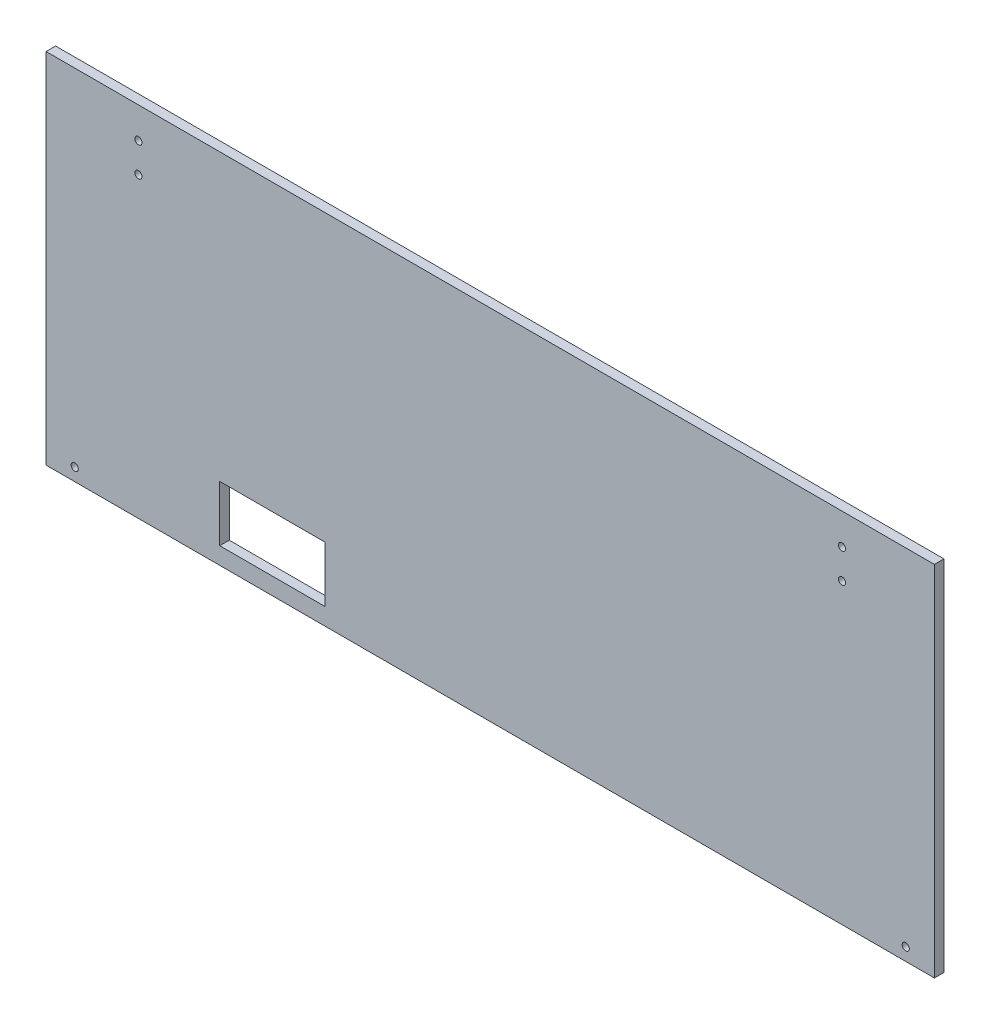
ISO-10303-21;
HEADER;
FILE_DESCRIPTION(('STEP AP214'),'2;1');
FILE_NAME('part.step','',(''),(''),'','','');
FILE_SCHEMA(('AUTOMOTIVE_DESIGN { 1 0 10303 214 1 1 1 1 }'));
ENDSEC;
DATA;
#1=APPLICATION_CONTEXT('core data for automotive mechanical design processes');
#2=APPLICATION_PROTOCOL_DEFINITION('international standard','automotive_design',2000,#1);
#3=PRODUCT_CONTEXT('',#1,'mechanical');
#4=PRODUCT('Part','Part','',(#3));
#5=PRODUCT_RELATED_PRODUCT_CATEGORY('part','',(#4));
#6=PRODUCT_DEFINITION_FORMATION('','',#4);
#7=PRODUCT_DEFINITION_CONTEXT('part definition',#1,'design');
#8=PRODUCT_DEFINITION('design','',#6,#7);
#9=PRODUCT_DEFINITION_SHAPE('','',#8);
#10=(LENGTH_UNIT() NAMED_UNIT(*) SI_UNIT(.MILLI.,.METRE.));
#11=(NAMED_UNIT(*) PLANE_ANGLE_UNIT() SI_UNIT($,.RADIAN.));
#12=(NAMED_UNIT(*) SI_UNIT($,.STERADIAN.) SOLID_ANGLE_UNIT());
#13=UNCERTAINTY_MEASURE_WITH_UNIT(LENGTH_MEASURE(1.E-05),#10,'distance_accuracy_value','');
#14=(GEOMETRIC_REPRESENTATION_CONTEXT(3) GLOBAL_UNCERTAINTY_ASSIGNED_CONTEXT((#13)) GLOBAL_UNIT_ASSIGNED_CONTEXT((#10,
#11,#12)) REPRESENTATION_CONTEXT('',''));
#15=CARTESIAN_POINT('',(0.,0.,0.));
#16=DIRECTION('',(0.,0.,1.));
#17=DIRECTION('',(1.,0.,0.));
#18=AXIS2_PLACEMENT_3D('',#15,#16,#17);
#19=CARTESIAN_POINT('',(279.,-112.5,6.));
#20=DIRECTION('',(-1.,0.,0.));
#21=DIRECTION('',(0.,0.,1.));
#22=AXIS2_PLACEMENT_3D('',#19,#20,#21);
#23=PLANE('',#22);
#24=DIRECTION('',(0.,1.,0.));
#25=VECTOR('',#24,1.);
#26=CARTESIAN_POINT('',(279.,-112.5,0.));
#27=LINE('',#26,#25);
#28=CARTESIAN_POINT('',(279.,-112.5,0.));
#29=VERTEX_POINT('',#28);
#30=CARTESIAN_POINT('',(279.,112.5,0.));
#31=VERTEX_POINT('',#30);
#32=EDGE_CURVE('E170',#29,#31,#27,.T.);
#33=ORIENTED_EDGE('',*,*,#32,.T.);
#34=DIRECTION('',(0.,0.,-1.));
#35=VECTOR('',#34,1.);
#36=CARTESIAN_POINT('',(279.,112.5,6.));
#37=LINE('',#36,#35);
#38=CARTESIAN_POINT('',(279.,112.5,6.));
#39=VERTEX_POINT('',#38);
#40=EDGE_CURVE('E11',#39,#31,#37,.T.);
#41=ORIENTED_EDGE('',*,*,#40,.F.);
#42=DIRECTION('',(0.,1.,0.));
#43=VECTOR('',#42,1.);
#44=CARTESIAN_POINT('',(279.,-112.5,6.));
#45=LINE('',#44,#43);
#46=CARTESIAN_POINT('',(279.,-112.5,6.));
#47=VERTEX_POINT('',#46);
#48=EDGE_CURVE('E171',#47,#39,#45,.T.);
#49=ORIENTED_EDGE('',*,*,#48,.F.);
#50=DIRECTION('',(0.,0.,-1.));
#51=VECTOR('',#50,1.);
#52=CARTESIAN_POINT('',(279.,-112.5,6.));
#53=LINE('',#52,#51);
#54=EDGE_CURVE('E181',#47,#29,#53,.T.);
#55=ORIENTED_EDGE('',*,*,#54,.T.);
#56=EDGE_LOOP('',(#33,#41,#49,#55));
#57=FACE_BOUND('',#56,.T.);
#58=ADVANCED_FACE('F37',(#57),#23,.F.);
#59=CARTESIAN_POINT('',(279.,112.5,6.));
#60=DIRECTION('',(0.,-1.,0.));
#61=DIRECTION('',(1.,0.,0.));
#62=AXIS2_PLACEMENT_3D('',#59,#60,#61);
#63=PLANE('',#62);
#64=DIRECTION('',(-1.,0.,0.));
#65=VECTOR('',#64,1.);
#66=CARTESIAN_POINT('',(279.,112.5,0.));
#67=LINE('',#66,#65);
#68=CARTESIAN_POINT('',(-279.,112.5,0.));
#69=VERTEX_POINT('',#68);
#70=EDGE_CURVE('E184',#31,#69,#67,.T.);
#71=ORIENTED_EDGE('',*,*,#70,.T.);
#72=DIRECTION('',(0.,0.,-1.));
#73=VECTOR('',#72,1.);
#74=CARTESIAN_POINT('',(-279.,112.5,6.));
#75=LINE('',#74,#73);
#76=CARTESIAN_POINT('',(-279.,112.5,6.));
#77=VERTEX_POINT('',#76);
#78=EDGE_CURVE('E44',#77,#69,#75,.T.);
#79=ORIENTED_EDGE('',*,*,#78,.F.);
#80=DIRECTION('',(-1.,0.,0.));
#81=VECTOR('',#80,1.);
#82=CARTESIAN_POINT('',(279.,112.5,6.));
#83=LINE('',#82,#81);
#84=EDGE_CURVE('E174',#39,#77,#83,.T.);
#85=ORIENTED_EDGE('',*,*,#84,.F.);
#86=ORIENTED_EDGE('',*,*,#40,.T.);
#87=EDGE_LOOP('',(#71,#79,#85,#86));
#88=FACE_BOUND('',#87,.T.);
#89=ADVANCED_FACE('F213',(#88),#63,.F.);
#90=CARTESIAN_POINT('',(-279.,-112.5,6.));
#91=DIRECTION('',(1.,0.,0.));
#92=DIRECTION('',(0.,0.,-1.));
#93=AXIS2_PLACEMENT_3D('',#90,#91,#92);
#94=PLANE('',#93);
#95=DIRECTION('',(0.,-1.,0.));
#96=VECTOR('',#95,1.);
#97=CARTESIAN_POINT('',(-279.,-112.5,0.));
#98=LINE('',#97,#96);
#99=CARTESIAN_POINT('',(-279.,-112.5,0.));
#100=VERTEX_POINT('',#99);
#101=EDGE_CURVE('E186',#69,#100,#98,.T.);
#102=ORIENTED_EDGE('',*,*,#101,.T.);
#103=DIRECTION('',(0.,0.,-1.));
#104=VECTOR('',#103,1.);
#105=CARTESIAN_POINT('',(-279.,-112.5,6.));
#106=LINE('',#105,#104);
#107=CARTESIAN_POINT('',(-279.,-112.5,6.));
#108=VERTEX_POINT('',#107);
#109=EDGE_CURVE('E191',#108,#100,#106,.T.);
#110=ORIENTED_EDGE('',*,*,#109,.F.);
#111=DIRECTION('',(0.,-1.,0.));
#112=VECTOR('',#111,1.);
#113=CARTESIAN_POINT('',(-279.,-112.5,6.));
#114=LINE('',#113,#112);
#115=EDGE_CURVE('E177',#77,#108,#114,.T.);
#116=ORIENTED_EDGE('',*,*,#115,.F.);
#117=ORIENTED_EDGE('',*,*,#78,.T.);
#118=EDGE_LOOP('',(#102,#110,#116,#117));
#119=FACE_BOUND('',#118,.T.);
#120=ADVANCED_FACE('F198',(#119),#94,.F.);
#121=CARTESIAN_POINT('',(279.,-112.5,6.));
#122=DIRECTION('',(0.,1.,0.));
#123=DIRECTION('',(-1.,0.,0.));
#124=AXIS2_PLACEMENT_3D('',#121,#122,#123);
#125=PLANE('',#124);
#126=DIRECTION('',(1.,0.,0.));
#127=VECTOR('',#126,1.);
#128=CARTESIAN_POINT('',(279.,-112.5,0.));
#129=LINE('',#128,#127);
#130=EDGE_CURVE('E175',#100,#29,#129,.T.);
#131=ORIENTED_EDGE('',*,*,#130,.T.);
#132=ORIENTED_EDGE('',*,*,#54,.F.);
#133=DIRECTION('',(1.,0.,0.));
#134=VECTOR('',#133,1.);
#135=CARTESIAN_POINT('',(279.,-112.5,6.));
#136=LINE('',#135,#134);
#137=EDGE_CURVE('E179',#108,#47,#136,.T.);
#138=ORIENTED_EDGE('',*,*,#137,.F.);
#139=ORIENTED_EDGE('',*,*,#109,.T.);
#140=EDGE_LOOP('',(#131,#132,#138,#139));
#141=FACE_BOUND('',#140,.T.);
#142=ADVANCED_FACE('F206',(#141),#125,.F.);
#143=CARTESIAN_POINT('',(0.,0.,6.));
#144=DIRECTION('',(0.,0.,1.));
#145=DIRECTION('',(1.,0.,0.));
#146=AXIS2_PLACEMENT_3D('',#143,#144,#145);
#147=PLANE('',#146);
#148=CARTESIAN_POINT('',(-261.,-104.5,6.));
#149=DIRECTION('',(0.,0.,1.));
#150=DIRECTION('',(1.,0.,0.));
#151=AXIS2_PLACEMENT_3D('',#148,#149,#150);
#152=CIRCLE('',#151,2.24999999999995);
#153=CARTESIAN_POINT('',(-258.75,-104.5,6.));
#154=VERTEX_POINT('',#153);
#155=EDGE_CURVE('E167',#154,#154,#152,.T.);
#156=ORIENTED_EDGE('',*,*,#155,.F.);
#157=EDGE_LOOP('',(#156));
#158=FACE_BOUND('',#157,.T.);
#159=CARTESIAN_POINT('',(261.,-104.5,6.));
#160=DIRECTION('',(0.,0.,1.));
#161=DIRECTION('',(1.,0.,0.));
#162=AXIS2_PLACEMENT_3D('',#159,#160,#161);
#163=CIRCLE('',#162,2.24999999999995);
#164=CARTESIAN_POINT('',(263.25,-104.5,6.));
#165=VERTEX_POINT('',#164);
#166=EDGE_CURVE('E164',#165,#165,#163,.T.);
#167=ORIENTED_EDGE('',*,*,#166,.F.);
#168=EDGE_LOOP('',(#167));
#169=FACE_BOUND('',#168,.T.);
#170=CARTESIAN_POINT('',(221.,74.4999999999999,6.));
#171=DIRECTION('',(0.,0.,1.));
#172=DIRECTION('',(1.,0.,0.));
#173=AXIS2_PLACEMENT_3D('',#170,#171,#172);
#174=CIRCLE('',#173,2.25000000000001);
#175=CARTESIAN_POINT('',(223.25,74.4999999999999,6.));
#176=VERTEX_POINT('',#175);
#177=EDGE_CURVE('E161',#176,#176,#174,.T.);
#178=ORIENTED_EDGE('',*,*,#177,.F.);
#179=EDGE_LOOP('',(#178));
#180=FACE_BOUND('',#179,.T.);
#181=CARTESIAN_POINT('',(-221.,93.,6.));
#182=DIRECTION('',(0.,0.,1.));
#183=DIRECTION('',(1.,0.,0.));
#184=AXIS2_PLACEMENT_3D('',#181,#182,#183);
#185=CIRCLE('',#184,2.25000000000001);
#186=CARTESIAN_POINT('',(-218.75,93.,6.));
#187=VERTEX_POINT('',#186);
#188=EDGE_CURVE('E158',#187,#187,#185,.T.);
#189=ORIENTED_EDGE('',*,*,#188,.F.);
#190=EDGE_LOOP('',(#189));
#191=FACE_BOUND('',#190,.T.);
#192=CARTESIAN_POINT('',(-221.,74.5,6.));
#193=DIRECTION('',(0.,0.,1.));
#194=DIRECTION('',(1.,0.,0.));
#195=AXIS2_PLACEMENT_3D('',#192,#193,#194);
#196=CIRCLE('',#195,2.25000000000001);
#197=CARTESIAN_POINT('',(-218.75,74.5,6.));
#198=VERTEX_POINT('',#197);
#199=EDGE_CURVE('E155',#198,#198,#196,.T.);
#200=ORIENTED_EDGE('',*,*,#199,.F.);
#201=EDGE_LOOP('',(#200));
#202=FACE_BOUND('',#201,.T.);
#203=DIRECTION('',(0.,1.,0.));
#204=VECTOR('',#203,1.);
#205=CARTESIAN_POINT('',(-103.925688,0.,6.));
#206=LINE('',#205,#204);
#207=CARTESIAN_POINT('',(-103.925688,-101.8,6.));
#208=VERTEX_POINT('',#207);
#209=CARTESIAN_POINT('',(-103.925688,-66.8,6.));
#210=VERTEX_POINT('',#209);
#211=EDGE_CURVE('E104',#208,#210,#206,.T.);
#212=ORIENTED_EDGE('',*,*,#211,.F.);
#213=DIRECTION('',(1.,0.,0.));
#214=VECTOR('',#213,1.);
#215=CARTESIAN_POINT('',(0.,-101.8,6.));
#216=LINE('',#215,#214);
#217=CARTESIAN_POINT('',(-169.925688,-101.8,6.));
#218=VERTEX_POINT('',#217);
#219=EDGE_CURVE('E148',#218,#208,#216,.T.);
#220=ORIENTED_EDGE('',*,*,#219,.F.);
#221=DIRECTION('',(0.,-1.,0.));
#222=VECTOR('',#221,1.);
#223=CARTESIAN_POINT('',(-169.925688,0.,6.));
#224=LINE('',#223,#222);
#225=CARTESIAN_POINT('',(-169.925688,-66.8,6.));
#226=VERTEX_POINT('',#225);
#227=EDGE_CURVE('E150',#226,#218,#224,.T.);
#228=ORIENTED_EDGE('',*,*,#227,.F.);
#229=DIRECTION('',(-1.,0.,0.));
#230=VECTOR('',#229,1.);
#231=CARTESIAN_POINT('',(0.,-66.8,6.));
#232=LINE('',#231,#230);
#233=EDGE_CURVE('E152',#210,#226,#232,.T.);
#234=ORIENTED_EDGE('',*,*,#233,.F.);
#235=EDGE_LOOP('',(#212,#220,#228,#234));
#236=FACE_BOUND('',#235,.T.);
#237=CARTESIAN_POINT('',(221.,92.9999999999999,6.));
#238=DIRECTION('',(0.,0.,1.));
#239=DIRECTION('',(1.,0.,0.));
#240=AXIS2_PLACEMENT_3D('',#237,#238,#239);
#241=CIRCLE('',#240,2.25000000000001);
#242=CARTESIAN_POINT('',(223.25,92.9999999999999,6.));
#243=VERTEX_POINT('',#242);
#244=EDGE_CURVE('E145',#243,#243,#241,.T.);
#245=ORIENTED_EDGE('',*,*,#244,.F.);
#246=EDGE_LOOP('',(#245));
#247=FACE_BOUND('',#246,.T.);
#248=ORIENTED_EDGE('',*,*,#48,.T.);
#249=ORIENTED_EDGE('',*,*,#84,.T.);
#250=ORIENTED_EDGE('',*,*,#115,.T.);
#251=ORIENTED_EDGE('',*,*,#137,.T.);
#252=EDGE_LOOP('',(#248,#249,#250,#251));
#253=FACE_BOUND('',#252,.T.);
#254=ADVANCED_FACE('F212',(#158,#169,#180,#191,#202,#236,#247,#253),#147,.T.);
#255=CARTESIAN_POINT('',(0.,0.,0.));
#256=DIRECTION('',(0.,0.,1.));
#257=DIRECTION('',(1.,0.,0.));
#258=AXIS2_PLACEMENT_3D('',#255,#256,#257);
#259=PLANE('',#258);
#260=CARTESIAN_POINT('',(-261.,-104.5,0.));
#261=DIRECTION('',(0.,0.,-1.));
#262=DIRECTION('',(-1.,0.,0.));
#263=AXIS2_PLACEMENT_3D('',#260,#261,#262);
#264=CIRCLE('',#263,2.24999999999995);
#265=CARTESIAN_POINT('',(-263.25,-104.5,0.));
#266=VERTEX_POINT('',#265);
#267=EDGE_CURVE('E140',#266,#266,#264,.T.);
#268=ORIENTED_EDGE('',*,*,#267,.F.);
#269=EDGE_LOOP('',(#268));
#270=FACE_BOUND('',#269,.T.);
#271=CARTESIAN_POINT('',(261.,-104.5,0.));
#272=DIRECTION('',(0.,0.,-1.));
#273=DIRECTION('',(-1.,0.,0.));
#274=AXIS2_PLACEMENT_3D('',#271,#272,#273);
#275=CIRCLE('',#274,2.24999999999995);
#276=CARTESIAN_POINT('',(258.75,-104.5,0.));
#277=VERTEX_POINT('',#276);
#278=EDGE_CURVE('E108',#277,#277,#275,.T.);
#279=ORIENTED_EDGE('',*,*,#278,.F.);
#280=EDGE_LOOP('',(#279));
#281=FACE_BOUND('',#280,.T.);
#282=CARTESIAN_POINT('',(221.,74.4999999999999,0.));
#283=DIRECTION('',(0.,0.,-1.));
#284=DIRECTION('',(-1.,0.,0.));
#285=AXIS2_PLACEMENT_3D('',#282,#283,#284);
#286=CIRCLE('',#285,2.25000000000001);
#287=CARTESIAN_POINT('',(218.75,74.4999999999999,0.));
#288=VERTEX_POINT('',#287);
#289=EDGE_CURVE('E132',#288,#288,#286,.T.);
#290=ORIENTED_EDGE('',*,*,#289,.F.);
#291=EDGE_LOOP('',(#290));
#292=FACE_BOUND('',#291,.T.);
#293=CARTESIAN_POINT('',(-221.,93.,0.));
#294=DIRECTION('',(0.,0.,-1.));
#295=DIRECTION('',(-1.,0.,0.));
#296=AXIS2_PLACEMENT_3D('',#293,#294,#295);
#297=CIRCLE('',#296,2.25000000000001);
#298=CARTESIAN_POINT('',(-223.25,93.,0.));
#299=VERTEX_POINT('',#298);
#300=EDGE_CURVE('E127',#299,#299,#297,.T.);
#301=ORIENTED_EDGE('',*,*,#300,.F.);
#302=EDGE_LOOP('',(#301));
#303=FACE_BOUND('',#302,.T.);
#304=CARTESIAN_POINT('',(-221.,74.5,0.));
#305=DIRECTION('',(0.,0.,-1.));
#306=DIRECTION('',(-1.,0.,0.));
#307=AXIS2_PLACEMENT_3D('',#304,#305,#306);
#308=CIRCLE('',#307,2.25000000000001);
#309=CARTESIAN_POINT('',(-223.25,74.5,0.));
#310=VERTEX_POINT('',#309);
#311=EDGE_CURVE('E124',#310,#310,#308,.T.);
#312=ORIENTED_EDGE('',*,*,#311,.F.);
#313=EDGE_LOOP('',(#312));
#314=FACE_BOUND('',#313,.T.);
#315=DIRECTION('',(-1.,0.,0.));
#316=VECTOR('',#315,1.);
#317=CARTESIAN_POINT('',(-103.925688,-101.8,0.));
#318=LINE('',#317,#316);
#319=CARTESIAN_POINT('',(-103.925688,-101.8,0.));
#320=VERTEX_POINT('',#319);
#321=CARTESIAN_POINT('',(-169.925688,-101.8,0.));
#322=VERTEX_POINT('',#321);
#323=EDGE_CURVE('E123',#320,#322,#318,.T.);
#324=ORIENTED_EDGE('',*,*,#323,.F.);
#325=DIRECTION('',(0.,-1.,0.));
#326=VECTOR('',#325,1.);
#327=CARTESIAN_POINT('',(-103.925688,-101.8,0.));
#328=LINE('',#327,#326);
#329=CARTESIAN_POINT('',(-103.925688,-66.8,0.));
#330=VERTEX_POINT('',#329);
#331=EDGE_CURVE('E59',#330,#320,#328,.T.);
#332=ORIENTED_EDGE('',*,*,#331,.F.);
#333=DIRECTION('',(1.,0.,0.));
#334=VECTOR('',#333,1.);
#335=CARTESIAN_POINT('',(-103.925688,-66.8,0.));
#336=LINE('',#335,#334);
#337=CARTESIAN_POINT('',(-169.925688,-66.8,0.));
#338=VERTEX_POINT('',#337);
#339=EDGE_CURVE('E111',#338,#330,#336,.T.);
#340=ORIENTED_EDGE('',*,*,#339,.F.);
#341=DIRECTION('',(0.,1.,0.));
#342=VECTOR('',#341,1.);
#343=CARTESIAN_POINT('',(-169.925688,-101.8,0.));
#344=LINE('',#343,#342);
#345=EDGE_CURVE('E117',#322,#338,#344,.T.);
#346=ORIENTED_EDGE('',*,*,#345,.F.);
#347=EDGE_LOOP('',(#324,#332,#340,#346));
#348=FACE_BOUND('',#347,.T.);
#349=CARTESIAN_POINT('',(221.,92.9999999999999,0.));
#350=DIRECTION('',(0.,0.,-1.));
#351=DIRECTION('',(-1.,0.,0.));
#352=AXIS2_PLACEMENT_3D('',#349,#350,#351);
#353=CIRCLE('',#352,2.25000000000001);
#354=CARTESIAN_POINT('',(218.75,92.9999999999999,0.));
#355=VERTEX_POINT('',#354);
#356=EDGE_CURVE('E135',#355,#355,#353,.T.);
#357=ORIENTED_EDGE('',*,*,#356,.F.);
#358=EDGE_LOOP('',(#357));
#359=FACE_BOUND('',#358,.T.);
#360=ORIENTED_EDGE('',*,*,#32,.F.);
#361=ORIENTED_EDGE('',*,*,#130,.F.);
#362=ORIENTED_EDGE('',*,*,#101,.F.);
#363=ORIENTED_EDGE('',*,*,#70,.F.);
#364=EDGE_LOOP('',(#360,#361,#362,#363));
#365=FACE_BOUND('',#364,.T.);
#366=ADVANCED_FACE('F121',(#270,#281,#292,#303,#314,#348,#359,#365),#259,.F.);
#367=CARTESIAN_POINT('',(221.,92.9999999999999,10.));
#368=DIRECTION('',(0.,0.,-1.));
#369=DIRECTION('',(-1.,0.,0.));
#370=AXIS2_PLACEMENT_3D('',#367,#368,#369);
#371=CYLINDRICAL_SURFACE('',#370,2.25000000000001);
#372=ORIENTED_EDGE('',*,*,#244,.T.);
#373=EDGE_LOOP('',(#372));
#374=FACE_BOUND('',#373,.T.);
#375=ORIENTED_EDGE('',*,*,#356,.T.);
#376=EDGE_LOOP('',(#375));
#377=FACE_BOUND('',#376,.T.);
#378=ADVANCED_FACE('F225',(#374,#377),#371,.F.);
#379=CARTESIAN_POINT('',(-103.925688,-101.8,10.));
#380=DIRECTION('',(1.,0.,0.));
#381=DIRECTION('',(0.,0.,-1.));
#382=AXIS2_PLACEMENT_3D('',#379,#380,#381);
#383=PLANE('',#382);
#384=ORIENTED_EDGE('',*,*,#211,.T.);
#385=DIRECTION('',(0.,0.,-1.));
#386=VECTOR('',#385,1.);
#387=CARTESIAN_POINT('',(-103.925688,-66.8,10.));
#388=LINE('',#387,#386);
#389=EDGE_CURVE('E100',#210,#330,#388,.T.);
#390=ORIENTED_EDGE('',*,*,#389,.T.);
#391=ORIENTED_EDGE('',*,*,#331,.T.);
#392=DIRECTION('',(0.,0.,-1.));
#393=VECTOR('',#392,1.);
#394=CARTESIAN_POINT('',(-103.925688,-101.8,10.));
#395=LINE('',#394,#393);
#396=EDGE_CURVE('E118',#208,#320,#395,.T.);
#397=ORIENTED_EDGE('',*,*,#396,.F.);
#398=EDGE_LOOP('',(#384,#390,#391,#397));
#399=FACE_BOUND('',#398,.T.);
#400=ADVANCED_FACE('F102',(#399),#383,.F.);
#401=CARTESIAN_POINT('',(-103.925688,-66.8,10.));
#402=DIRECTION('',(0.,1.,0.));
#403=DIRECTION('',(0.,0.,1.));
#404=AXIS2_PLACEMENT_3D('',#401,#402,#403);
#405=PLANE('',#404);
#406=ORIENTED_EDGE('',*,*,#233,.T.);
#407=DIRECTION('',(0.,0.,-1.));
#408=VECTOR('',#407,1.);
#409=CARTESIAN_POINT('',(-169.925688,-66.8,10.));
#410=LINE('',#409,#408);
#411=EDGE_CURVE('E107',#226,#338,#410,.T.);
#412=ORIENTED_EDGE('',*,*,#411,.T.);
#413=ORIENTED_EDGE('',*,*,#339,.T.);
#414=ORIENTED_EDGE('',*,*,#389,.F.);
#415=EDGE_LOOP('',(#406,#412,#413,#414));
#416=FACE_BOUND('',#415,.T.);
#417=ADVANCED_FACE('F112',(#416),#405,.F.);
#418=CARTESIAN_POINT('',(-169.925688,-101.8,10.));
#419=DIRECTION('',(-1.,0.,0.));
#420=DIRECTION('',(0.,0.,1.));
#421=AXIS2_PLACEMENT_3D('',#418,#419,#420);
#422=PLANE('',#421);
#423=ORIENTED_EDGE('',*,*,#227,.T.);
#424=DIRECTION('',(0.,0.,-1.));
#425=VECTOR('',#424,1.);
#426=CARTESIAN_POINT('',(-169.925688,-101.8,10.));
#427=LINE('',#426,#425);
#428=EDGE_CURVE('E51',#218,#322,#427,.T.);
#429=ORIENTED_EDGE('',*,*,#428,.T.);
#430=ORIENTED_EDGE('',*,*,#345,.T.);
#431=ORIENTED_EDGE('',*,*,#411,.F.);
#432=EDGE_LOOP('',(#423,#429,#430,#431));
#433=FACE_BOUND('',#432,.T.);
#434=ADVANCED_FACE('F252',(#433),#422,.F.);
#435=CARTESIAN_POINT('',(-103.925688,-101.8,10.));
#436=DIRECTION('',(0.,-1.,0.));
#437=DIRECTION('',(0.,0.,-1.));
#438=AXIS2_PLACEMENT_3D('',#435,#436,#437);
#439=PLANE('',#438);
#440=ORIENTED_EDGE('',*,*,#219,.T.);
#441=ORIENTED_EDGE('',*,*,#396,.T.);
#442=ORIENTED_EDGE('',*,*,#323,.T.);
#443=ORIENTED_EDGE('',*,*,#428,.F.);
#444=EDGE_LOOP('',(#440,#441,#442,#443));
#445=FACE_BOUND('',#444,.T.);
#446=ADVANCED_FACE('F255',(#445),#439,.F.);
#447=CARTESIAN_POINT('',(-221.,74.5,10.));
#448=DIRECTION('',(0.,0.,-1.));
#449=DIRECTION('',(-1.,0.,0.));
#450=AXIS2_PLACEMENT_3D('',#447,#448,#449);
#451=CYLINDRICAL_SURFACE('',#450,2.25000000000001);
#452=ORIENTED_EDGE('',*,*,#199,.T.);
#453=EDGE_LOOP('',(#452));
#454=FACE_BOUND('',#453,.T.);
#455=ORIENTED_EDGE('',*,*,#311,.T.);
#456=EDGE_LOOP('',(#455));
#457=FACE_BOUND('',#456,.T.);
#458=ADVANCED_FACE('F245',(#454,#457),#451,.F.);
#459=CARTESIAN_POINT('',(-221.,93.,10.));
#460=DIRECTION('',(0.,0.,-1.));
#461=DIRECTION('',(-1.,0.,0.));
#462=AXIS2_PLACEMENT_3D('',#459,#460,#461);
#463=CYLINDRICAL_SURFACE('',#462,2.25000000000001);
#464=ORIENTED_EDGE('',*,*,#188,.T.);
#465=EDGE_LOOP('',(#464));
#466=FACE_BOUND('',#465,.T.);
#467=ORIENTED_EDGE('',*,*,#300,.T.);
#468=EDGE_LOOP('',(#467));
#469=FACE_BOUND('',#468,.T.);
#470=ADVANCED_FACE('F242',(#466,#469),#463,.F.);
#471=CARTESIAN_POINT('',(221.,74.4999999999999,10.));
#472=DIRECTION('',(0.,0.,-1.));
#473=DIRECTION('',(-1.,0.,0.));
#474=AXIS2_PLACEMENT_3D('',#471,#472,#473);
#475=CYLINDRICAL_SURFACE('',#474,2.25000000000001);
#476=ORIENTED_EDGE('',*,*,#177,.T.);
#477=EDGE_LOOP('',(#476));
#478=FACE_BOUND('',#477,.T.);
#479=ORIENTED_EDGE('',*,*,#289,.T.);
#480=EDGE_LOOP('',(#479));
#481=FACE_BOUND('',#480,.T.);
#482=ADVANCED_FACE('F240',(#478,#481),#475,.F.);
#483=CARTESIAN_POINT('',(261.,-104.5,10.));
#484=DIRECTION('',(0.,0.,-1.));
#485=DIRECTION('',(-1.,0.,0.));
#486=AXIS2_PLACEMENT_3D('',#483,#484,#485);
#487=CYLINDRICAL_SURFACE('',#486,2.24999999999995);
#488=ORIENTED_EDGE('',*,*,#166,.T.);
#489=EDGE_LOOP('',(#488));
#490=FACE_BOUND('',#489,.T.);
#491=ORIENTED_EDGE('',*,*,#278,.T.);
#492=EDGE_LOOP('',(#491));
#493=FACE_BOUND('',#492,.T.);
#494=ADVANCED_FACE('F236',(#490,#493),#487,.F.);
#495=CARTESIAN_POINT('',(-261.,-104.5,10.));
#496=DIRECTION('',(0.,0.,-1.));
#497=DIRECTION('',(-1.,0.,0.));
#498=AXIS2_PLACEMENT_3D('',#495,#496,#497);
#499=CYLINDRICAL_SURFACE('',#498,2.24999999999995);
#500=ORIENTED_EDGE('',*,*,#155,.T.);
#501=EDGE_LOOP('',(#500));
#502=FACE_BOUND('',#501,.T.);
#503=ORIENTED_EDGE('',*,*,#267,.T.);
#504=EDGE_LOOP('',(#503));
#505=FACE_BOUND('',#504,.T.);
#506=ADVANCED_FACE('F233',(#502,#505),#499,.F.);
#507=CLOSED_SHELL('',(#58,#89,#120,#142,#254,#366,#378,#400,#417,#434,#446,#458,#470,#482,#494,#506));
#508=MANIFOLD_SOLID_BREP('B2',#507);
#509=ADVANCED_BREP_SHAPE_REPRESENTATION('',(#18,#508),#14);
#510=SHAPE_DEFINITION_REPRESENTATION(#9,#509);
ENDSEC;
END-ISO-10303-21;
